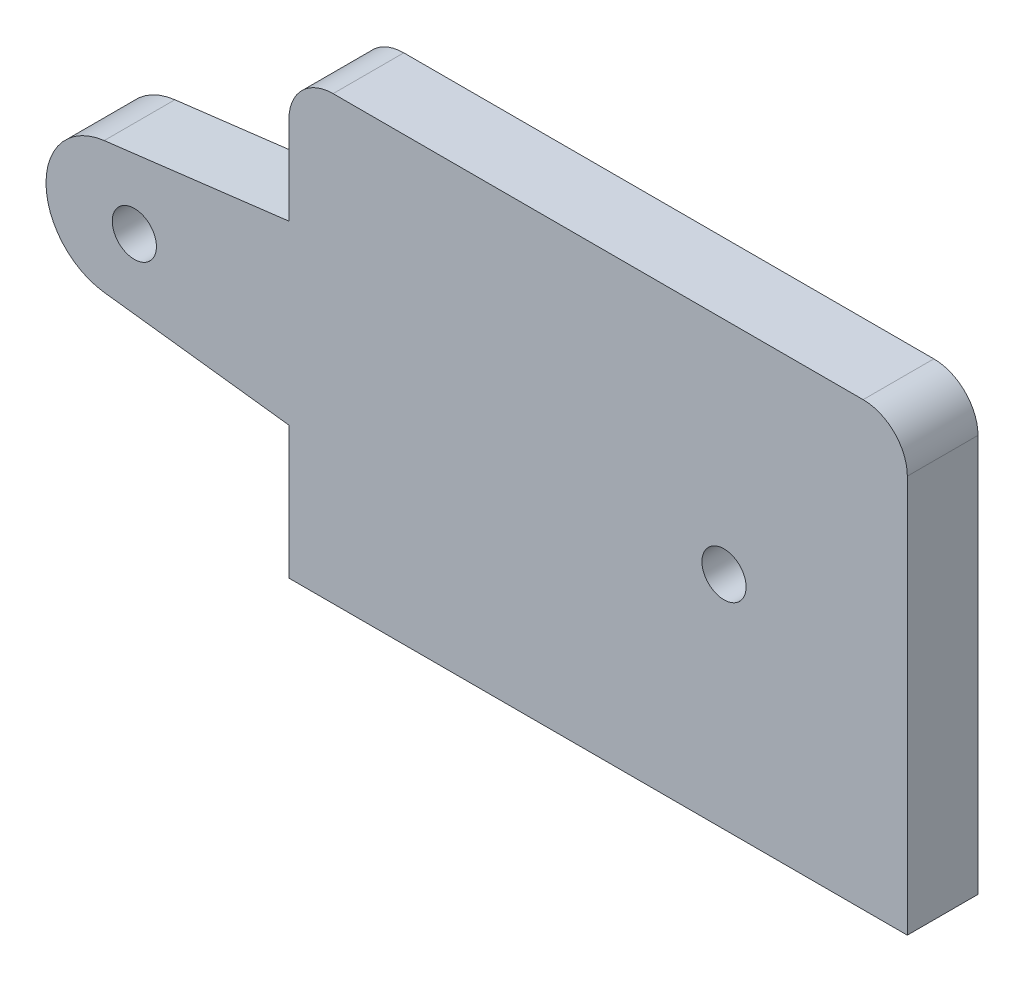
ISO-10303-21;
HEADER;
FILE_DESCRIPTION(('STEP AP214'),'2;1');
FILE_NAME('part.step','',(''),(''),'','','');
FILE_SCHEMA(('AUTOMOTIVE_DESIGN { 1 0 10303 214 1 1 1 1 }'));
ENDSEC;
DATA;
#1=APPLICATION_CONTEXT('core data for automotive mechanical design processes');
#2=APPLICATION_PROTOCOL_DEFINITION('international standard','automotive_design',2000,#1);
#3=PRODUCT_CONTEXT('',#1,'mechanical');
#4=PRODUCT('Part','Part','',(#3));
#5=PRODUCT_RELATED_PRODUCT_CATEGORY('part','',(#4));
#6=PRODUCT_DEFINITION_FORMATION('','',#4);
#7=PRODUCT_DEFINITION_CONTEXT('part definition',#1,'design');
#8=PRODUCT_DEFINITION('design','',#6,#7);
#9=PRODUCT_DEFINITION_SHAPE('','',#8);
#10=(LENGTH_UNIT() NAMED_UNIT(*) SI_UNIT(.MILLI.,.METRE.));
#11=(NAMED_UNIT(*) PLANE_ANGLE_UNIT() SI_UNIT($,.RADIAN.));
#12=(NAMED_UNIT(*) SI_UNIT($,.STERADIAN.) SOLID_ANGLE_UNIT());
#13=UNCERTAINTY_MEASURE_WITH_UNIT(LENGTH_MEASURE(1.E-05),#10,'distance_accuracy_value','');
#14=(GEOMETRIC_REPRESENTATION_CONTEXT(3) GLOBAL_UNCERTAINTY_ASSIGNED_CONTEXT((#13)) GLOBAL_UNIT_ASSIGNED_CONTEXT((#10,
#11,#12)) REPRESENTATION_CONTEXT('',''));
#15=CARTESIAN_POINT('',(0.,0.,0.));
#16=DIRECTION('',(0.,0.,1.));
#17=DIRECTION('',(1.,0.,0.));
#18=AXIS2_PLACEMENT_3D('',#15,#16,#17);
#19=CARTESIAN_POINT('',(30.,20.,8.));
#20=DIRECTION('',(0.,0.,-1.));
#21=DIRECTION('',(-1.,0.,0.));
#22=AXIS2_PLACEMENT_3D('',#19,#20,#21);
#23=CYLINDRICAL_SURFACE('',#22,5.);
#24=CARTESIAN_POINT('',(30.,20.,0.));
#25=DIRECTION('',(0.,0.,1.));
#26=DIRECTION('',(1.,0.,0.));
#27=AXIS2_PLACEMENT_3D('',#24,#25,#26);
#28=CIRCLE('',#27,5.);
#29=CARTESIAN_POINT('',(30.,25.,0.));
#30=VERTEX_POINT('',#29);
#31=CARTESIAN_POINT('',(35.,20.,0.));
#32=VERTEX_POINT('',#31);
#33=EDGE_CURVE('E178',#30,#32,#28,.F.);
#34=ORIENTED_EDGE('',*,*,#33,.F.);
#35=DIRECTION('',(0.,0.,-1.));
#36=VECTOR('',#35,1.);
#37=CARTESIAN_POINT('',(30.,25.,8.));
#38=LINE('',#37,#36);
#39=CARTESIAN_POINT('',(30.,25.,8.));
#40=VERTEX_POINT('',#39);
#41=EDGE_CURVE('E11',#40,#30,#38,.T.);
#42=ORIENTED_EDGE('',*,*,#41,.F.);
#43=CARTESIAN_POINT('',(30.,20.,8.));
#44=DIRECTION('',(0.,0.,1.));
#45=DIRECTION('',(1.,0.,0.));
#46=AXIS2_PLACEMENT_3D('',#43,#44,#45);
#47=CIRCLE('',#46,5.);
#48=CARTESIAN_POINT('',(35.,20.,8.));
#49=VERTEX_POINT('',#48);
#50=EDGE_CURVE('E255',#40,#49,#47,.F.);
#51=ORIENTED_EDGE('',*,*,#50,.T.);
#52=DIRECTION('',(0.,0.,-1.));
#53=VECTOR('',#52,1.);
#54=CARTESIAN_POINT('',(35.,20.,8.));
#55=LINE('',#54,#53);
#56=EDGE_CURVE('E55',#49,#32,#55,.T.);
#57=ORIENTED_EDGE('',*,*,#56,.T.);
#58=EDGE_LOOP('',(#34,#42,#51,#57));
#59=FACE_BOUND('',#58,.T.);
#60=ADVANCED_FACE('F38',(#59),#23,.T.);
#61=CARTESIAN_POINT('',(0.,25.,8.));
#62=DIRECTION('',(0.,1.,0.));
#63=DIRECTION('',(0.,0.,1.));
#64=AXIS2_PLACEMENT_3D('',#61,#62,#63);
#65=PLANE('',#64);
#66=DIRECTION('',(1.,0.,0.));
#67=VECTOR('',#66,1.);
#68=CARTESIAN_POINT('',(0.,25.,0.));
#69=LINE('',#68,#67);
#70=CARTESIAN_POINT('',(-30.,25.,0.));
#71=VERTEX_POINT('',#70);
#72=EDGE_CURVE('E173',#71,#30,#69,.T.);
#73=ORIENTED_EDGE('',*,*,#72,.F.);
#74=DIRECTION('',(0.,0.,-1.));
#75=VECTOR('',#74,1.);
#76=CARTESIAN_POINT('',(-30.,25.,8.));
#77=LINE('',#76,#75);
#78=CARTESIAN_POINT('',(-30.,25.,8.));
#79=VERTEX_POINT('',#78);
#80=EDGE_CURVE('E47',#79,#71,#77,.T.);
#81=ORIENTED_EDGE('',*,*,#80,.F.);
#82=DIRECTION('',(1.,0.,0.));
#83=VECTOR('',#82,1.);
#84=CARTESIAN_POINT('',(0.,25.,8.));
#85=LINE('',#84,#83);
#86=EDGE_CURVE('E257',#79,#40,#85,.T.);
#87=ORIENTED_EDGE('',*,*,#86,.T.);
#88=ORIENTED_EDGE('',*,*,#41,.T.);
#89=EDGE_LOOP('',(#73,#81,#87,#88));
#90=FACE_BOUND('',#89,.T.);
#91=ADVANCED_FACE('F177',(#90),#65,.T.);
#92=CARTESIAN_POINT('',(-30.,20.,8.));
#93=DIRECTION('',(0.,0.,-1.));
#94=DIRECTION('',(-1.,0.,0.));
#95=AXIS2_PLACEMENT_3D('',#92,#93,#94);
#96=CYLINDRICAL_SURFACE('',#95,5.);
#97=CARTESIAN_POINT('',(-30.,20.,0.));
#98=DIRECTION('',(0.,0.,1.));
#99=DIRECTION('',(1.,0.,0.));
#100=AXIS2_PLACEMENT_3D('',#97,#98,#99);
#101=CIRCLE('',#100,5.);
#102=CARTESIAN_POINT('',(-35.,20.,0.));
#103=VERTEX_POINT('',#102);
#104=EDGE_CURVE('E162',#71,#103,#101,.T.);
#105=ORIENTED_EDGE('',*,*,#104,.T.);
#106=DIRECTION('',(0.,0.,-1.));
#107=VECTOR('',#106,1.);
#108=CARTESIAN_POINT('',(-35.,20.,8.));
#109=LINE('',#108,#107);
#110=CARTESIAN_POINT('',(-35.,20.,8.));
#111=VERTEX_POINT('',#110);
#112=EDGE_CURVE('E154',#111,#103,#109,.T.);
#113=ORIENTED_EDGE('',*,*,#112,.F.);
#114=CARTESIAN_POINT('',(-30.,20.,8.));
#115=DIRECTION('',(0.,0.,1.));
#116=DIRECTION('',(1.,0.,0.));
#117=AXIS2_PLACEMENT_3D('',#114,#115,#116);
#118=CIRCLE('',#117,5.);
#119=EDGE_CURVE('E164',#79,#111,#118,.T.);
#120=ORIENTED_EDGE('',*,*,#119,.F.);
#121=ORIENTED_EDGE('',*,*,#80,.T.);
#122=EDGE_LOOP('',(#105,#113,#120,#121));
#123=FACE_BOUND('',#122,.T.);
#124=ADVANCED_FACE('F160',(#123),#96,.T.);
#125=CARTESIAN_POINT('',(-35.,0.,8.));
#126=DIRECTION('',(1.,0.,0.));
#127=DIRECTION('',(0.,1.,0.));
#128=AXIS2_PLACEMENT_3D('',#125,#126,#127);
#129=PLANE('',#128);
#130=DIRECTION('',(0.,-1.,0.));
#131=VECTOR('',#130,1.);
#132=CARTESIAN_POINT('',(-35.,0.,0.));
#133=LINE('',#132,#131);
#134=CARTESIAN_POINT('',(-35.,10.,0.));
#135=VERTEX_POINT('',#134);
#136=EDGE_CURVE('E175',#103,#135,#133,.T.);
#137=ORIENTED_EDGE('',*,*,#136,.T.);
#138=DIRECTION('',(0.,0.,-1.));
#139=VECTOR('',#138,1.);
#140=CARTESIAN_POINT('',(-35.,10.,8.));
#141=LINE('',#140,#139);
#142=CARTESIAN_POINT('',(-35.,10.,8.));
#143=VERTEX_POINT('',#142);
#144=EDGE_CURVE('E151',#143,#135,#141,.T.);
#145=ORIENTED_EDGE('',*,*,#144,.F.);
#146=DIRECTION('',(0.,-1.,0.));
#147=VECTOR('',#146,1.);
#148=CARTESIAN_POINT('',(-35.,0.,8.));
#149=LINE('',#148,#147);
#150=EDGE_CURVE('E136',#111,#143,#149,.T.);
#151=ORIENTED_EDGE('',*,*,#150,.F.);
#152=ORIENTED_EDGE('',*,*,#112,.T.);
#153=EDGE_LOOP('',(#137,#145,#151,#152));
#154=FACE_BOUND('',#153,.T.);
#155=ADVANCED_FACE('F231',(#154),#129,.F.);
#156=CARTESIAN_POINT('',(-1.71915903920015,14.0672519855766,8.));
#157=DIRECTION('',(0.121307488658819,-0.992614977317636,0.));
#158=DIRECTION('',(0.992614977317636,0.121307488658819,0.));
#159=AXIS2_PLACEMENT_3D('',#156,#157,#158);
#160=PLANE('',#159);
#161=DIRECTION('',(-0.992614977317636,-0.121307488658819,0.));
#162=VECTOR('',#161,1.);
#163=CARTESIAN_POINT('',(-1.71915903920015,14.0672519855766,0.));
#164=LINE('',#163,#162);
#165=CARTESIAN_POINT('',(-55.9098061649412,7.44461232988227,0.));
#166=VERTEX_POINT('',#165);
#167=EDGE_CURVE('E185',#135,#166,#164,.T.);
#168=ORIENTED_EDGE('',*,*,#167,.T.);
#169=DIRECTION('',(0.,0.,-1.));
#170=VECTOR('',#169,1.);
#171=CARTESIAN_POINT('',(-55.9098061649412,7.44461232988227,8.));
#172=LINE('',#171,#170);
#173=CARTESIAN_POINT('',(-55.9098061649412,7.44461232988227,8.));
#174=VERTEX_POINT('',#173);
#175=EDGE_CURVE('E148',#174,#166,#172,.T.);
#176=ORIENTED_EDGE('',*,*,#175,.F.);
#177=DIRECTION('',(-0.992614977317636,-0.121307488658819,0.));
#178=VECTOR('',#177,1.);
#179=CARTESIAN_POINT('',(-1.71915903920015,14.0672519855766,8.));
#180=LINE('',#179,#178);
#181=EDGE_CURVE('E263',#143,#174,#180,.T.);
#182=ORIENTED_EDGE('',*,*,#181,.F.);
#183=ORIENTED_EDGE('',*,*,#144,.T.);
#184=EDGE_LOOP('',(#168,#176,#182,#183));
#185=FACE_BOUND('',#184,.T.);
#186=ADVANCED_FACE('F232',(#185),#160,.F.);
#187=CARTESIAN_POINT('',(-55.,0.,8.));
#188=DIRECTION('',(0.,0.,-1.));
#189=DIRECTION('',(-1.,0.,0.));
#190=AXIS2_PLACEMENT_3D('',#187,#188,#189);
#191=CYLINDRICAL_SURFACE('',#190,7.50000000000001);
#192=CARTESIAN_POINT('',(-55.,0.,0.));
#193=DIRECTION('',(0.,0.,1.));
#194=DIRECTION('',(1.,0.,0.));
#195=AXIS2_PLACEMENT_3D('',#192,#193,#194);
#196=CIRCLE('',#195,7.50000000000001);
#197=CARTESIAN_POINT('',(-55.9098061649412,-7.44461232988228,0.));
#198=VERTEX_POINT('',#197);
#199=EDGE_CURVE('E188',#166,#198,#196,.T.);
#200=ORIENTED_EDGE('',*,*,#199,.T.);
#201=DIRECTION('',(0.,0.,-1.));
#202=VECTOR('',#201,1.);
#203=CARTESIAN_POINT('',(-55.9098061649412,-7.44461232988228,8.));
#204=LINE('',#203,#202);
#205=CARTESIAN_POINT('',(-55.9098061649412,-7.44461232988228,8.));
#206=VERTEX_POINT('',#205);
#207=EDGE_CURVE('E142',#206,#198,#204,.T.);
#208=ORIENTED_EDGE('',*,*,#207,.F.);
#209=CARTESIAN_POINT('',(-55.,0.,8.));
#210=DIRECTION('',(0.,0.,1.));
#211=DIRECTION('',(1.,0.,0.));
#212=AXIS2_PLACEMENT_3D('',#209,#210,#211);
#213=CIRCLE('',#212,7.50000000000001);
#214=EDGE_CURVE('E266',#174,#206,#213,.T.);
#215=ORIENTED_EDGE('',*,*,#214,.F.);
#216=ORIENTED_EDGE('',*,*,#175,.T.);
#217=EDGE_LOOP('',(#200,#208,#215,#216));
#218=FACE_BOUND('',#217,.T.);
#219=ADVANCED_FACE('F235',(#218),#191,.T.);
#220=CARTESIAN_POINT('',(-1.71915903920014,-14.0672519855765,8.));
#221=DIRECTION('',(-0.121307488658818,-0.992614977317636,0.));
#222=DIRECTION('',(0.992614977317636,-0.121307488658818,0.));
#223=AXIS2_PLACEMENT_3D('',#220,#221,#222);
#224=PLANE('',#223);
#225=DIRECTION('',(-0.992614977317636,0.121307488658818,0.));
#226=VECTOR('',#225,1.);
#227=CARTESIAN_POINT('',(-1.71915903920014,-14.0672519855765,0.));
#228=LINE('',#227,#226);
#229=CARTESIAN_POINT('',(-35.,-9.99999999999999,0.));
#230=VERTEX_POINT('',#229);
#231=EDGE_CURVE('E191',#230,#198,#228,.T.);
#232=ORIENTED_EDGE('',*,*,#231,.F.);
#233=DIRECTION('',(0.,0.,-1.));
#234=VECTOR('',#233,1.);
#235=CARTESIAN_POINT('',(-35.,-9.99999999999999,8.));
#236=LINE('',#235,#234);
#237=CARTESIAN_POINT('',(-35.,-9.99999999999999,8.));
#238=VERTEX_POINT('',#237);
#239=EDGE_CURVE('E140',#238,#230,#236,.T.);
#240=ORIENTED_EDGE('',*,*,#239,.F.);
#241=DIRECTION('',(-0.992614977317636,0.121307488658818,0.));
#242=VECTOR('',#241,1.);
#243=CARTESIAN_POINT('',(-1.71915903920014,-14.0672519855765,8.));
#244=LINE('',#243,#242);
#245=EDGE_CURVE('E133',#238,#206,#244,.T.);
#246=ORIENTED_EDGE('',*,*,#245,.T.);
#247=ORIENTED_EDGE('',*,*,#207,.T.);
#248=EDGE_LOOP('',(#232,#240,#246,#247));
#249=FACE_BOUND('',#248,.T.);
#250=ADVANCED_FACE('F239',(#249),#224,.T.);
#251=CARTESIAN_POINT('',(-35.,-25.,0.));
#252=VERTEX_POINT('',#251);
#253=EDGE_CURVE('E139',#230,#252,#133,.T.);
#254=ORIENTED_EDGE('',*,*,#253,.T.);
#255=DIRECTION('',(0.,0.,-1.));
#256=VECTOR('',#255,1.);
#257=CARTESIAN_POINT('',(-35.,-25.,8.));
#258=LINE('',#257,#256);
#259=CARTESIAN_POINT('',(-35.,-25.,8.));
#260=VERTEX_POINT('',#259);
#261=EDGE_CURVE('E121',#260,#252,#258,.T.);
#262=ORIENTED_EDGE('',*,*,#261,.F.);
#263=EDGE_CURVE('E126',#238,#260,#149,.T.);
#264=ORIENTED_EDGE('',*,*,#263,.F.);
#265=ORIENTED_EDGE('',*,*,#239,.T.);
#266=EDGE_LOOP('',(#254,#262,#264,#265));
#267=FACE_BOUND('',#266,.T.);
#268=ADVANCED_FACE('F137',(#267),#129,.F.);
#269=CARTESIAN_POINT('',(0.,-25.,8.));
#270=DIRECTION('',(0.,1.,0.));
#271=DIRECTION('',(0.,0.,1.));
#272=AXIS2_PLACEMENT_3D('',#269,#270,#271);
#273=PLANE('',#272);
#274=DIRECTION('',(1.,0.,0.));
#275=VECTOR('',#274,1.);
#276=CARTESIAN_POINT('',(0.,-25.,0.));
#277=LINE('',#276,#275);
#278=CARTESIAN_POINT('',(35.,-25.,0.));
#279=VERTEX_POINT('',#278);
#280=EDGE_CURVE('E194',#252,#279,#277,.T.);
#281=ORIENTED_EDGE('',*,*,#280,.T.);
#282=DIRECTION('',(0.,0.,-1.));
#283=VECTOR('',#282,1.);
#284=CARTESIAN_POINT('',(35.,-25.,8.));
#285=LINE('',#284,#283);
#286=CARTESIAN_POINT('',(35.,-25.,8.));
#287=VERTEX_POINT('',#286);
#288=EDGE_CURVE('E87',#287,#279,#285,.T.);
#289=ORIENTED_EDGE('',*,*,#288,.F.);
#290=DIRECTION('',(1.,0.,0.));
#291=VECTOR('',#290,1.);
#292=CARTESIAN_POINT('',(0.,-25.,8.));
#293=LINE('',#292,#291);
#294=EDGE_CURVE('E117',#260,#287,#293,.T.);
#295=ORIENTED_EDGE('',*,*,#294,.F.);
#296=ORIENTED_EDGE('',*,*,#261,.T.);
#297=EDGE_LOOP('',(#281,#289,#295,#296));
#298=FACE_BOUND('',#297,.T.);
#299=ADVANCED_FACE('F119',(#298),#273,.F.);
#300=CARTESIAN_POINT('',(35.,0.,8.));
#301=DIRECTION('',(1.,0.,0.));
#302=DIRECTION('',(0.,1.,0.));
#303=AXIS2_PLACEMENT_3D('',#300,#301,#302);
#304=PLANE('',#303);
#305=DIRECTION('',(0.,-1.,0.));
#306=VECTOR('',#305,1.);
#307=CARTESIAN_POINT('',(35.,0.,0.));
#308=LINE('',#307,#306);
#309=EDGE_CURVE('E196',#32,#279,#308,.T.);
#310=ORIENTED_EDGE('',*,*,#309,.F.);
#311=ORIENTED_EDGE('',*,*,#56,.F.);
#312=DIRECTION('',(0.,-1.,0.));
#313=VECTOR('',#312,1.);
#314=CARTESIAN_POINT('',(35.,0.,8.));
#315=LINE('',#314,#313);
#316=EDGE_CURVE('E125',#49,#287,#315,.T.);
#317=ORIENTED_EDGE('',*,*,#316,.T.);
#318=ORIENTED_EDGE('',*,*,#288,.T.);
#319=EDGE_LOOP('',(#310,#311,#317,#318));
#320=FACE_BOUND('',#319,.T.);
#321=ADVANCED_FACE('F214',(#320),#304,.T.);
#322=CARTESIAN_POINT('',(14.25,0.,8.));
#323=DIRECTION('',(0.,0.,-1.));
#324=DIRECTION('',(-1.,0.,0.));
#325=AXIS2_PLACEMENT_3D('',#322,#323,#324);
#326=CYLINDRICAL_SURFACE('',#325,2.5);
#327=CARTESIAN_POINT('',(14.25,0.,8.));
#328=DIRECTION('',(0.,0.,1.));
#329=DIRECTION('',(1.,0.,0.));
#330=AXIS2_PLACEMENT_3D('',#327,#328,#329);
#331=CIRCLE('',#330,2.5);
#332=CARTESIAN_POINT('',(16.75,0.,8.));
#333=VERTEX_POINT('',#332);
#334=EDGE_CURVE('E201',#333,#333,#331,.T.);
#335=ORIENTED_EDGE('',*,*,#334,.T.);
#336=EDGE_LOOP('',(#335));
#337=FACE_BOUND('',#336,.T.);
#338=CARTESIAN_POINT('',(14.25,0.,0.));
#339=DIRECTION('',(0.,0.,1.));
#340=DIRECTION('',(1.,0.,0.));
#341=AXIS2_PLACEMENT_3D('',#338,#339,#340);
#342=CIRCLE('',#341,2.5);
#343=CARTESIAN_POINT('',(16.75,0.,0.));
#344=VERTEX_POINT('',#343);
#345=EDGE_CURVE('E180',#344,#344,#342,.T.);
#346=ORIENTED_EDGE('',*,*,#345,.F.);
#347=EDGE_LOOP('',(#346));
#348=FACE_BOUND('',#347,.T.);
#349=ADVANCED_FACE('F40',(#337,#348),#326,.F.);
#350=CARTESIAN_POINT('',(-52.5,0.,8.));
#351=DIRECTION('',(0.,0.,-1.));
#352=DIRECTION('',(-1.,0.,0.));
#353=AXIS2_PLACEMENT_3D('',#350,#351,#352);
#354=CYLINDRICAL_SURFACE('',#353,2.49999999999999);
#355=CARTESIAN_POINT('',(-52.5,0.,8.));
#356=DIRECTION('',(0.,0.,1.));
#357=DIRECTION('',(1.,0.,0.));
#358=AXIS2_PLACEMENT_3D('',#355,#356,#357);
#359=CIRCLE('',#358,2.49999999999999);
#360=CARTESIAN_POINT('',(-50.,0.,8.));
#361=VERTEX_POINT('',#360);
#362=EDGE_CURVE('E202',#361,#361,#359,.T.);
#363=ORIENTED_EDGE('',*,*,#362,.T.);
#364=EDGE_LOOP('',(#363));
#365=FACE_BOUND('',#364,.T.);
#366=CARTESIAN_POINT('',(-52.5,0.,0.));
#367=DIRECTION('',(0.,0.,1.));
#368=DIRECTION('',(1.,0.,0.));
#369=AXIS2_PLACEMENT_3D('',#366,#367,#368);
#370=CIRCLE('',#369,2.49999999999999);
#371=CARTESIAN_POINT('',(-50.,0.,0.));
#372=VERTEX_POINT('',#371);
#373=EDGE_CURVE('E199',#372,#372,#370,.T.);
#374=ORIENTED_EDGE('',*,*,#373,.F.);
#375=EDGE_LOOP('',(#374));
#376=FACE_BOUND('',#375,.T.);
#377=ADVANCED_FACE('F213',(#365,#376),#354,.F.);
#378=CARTESIAN_POINT('',(0.,0.,8.));
#379=DIRECTION('',(0.,0.,1.));
#380=DIRECTION('',(1.,0.,0.));
#381=AXIS2_PLACEMENT_3D('',#378,#379,#380);
#382=PLANE('',#381);
#383=ORIENTED_EDGE('',*,*,#334,.F.);
#384=EDGE_LOOP('',(#383));
#385=FACE_BOUND('',#384,.T.);
#386=ORIENTED_EDGE('',*,*,#50,.F.);
#387=ORIENTED_EDGE('',*,*,#86,.F.);
#388=ORIENTED_EDGE('',*,*,#119,.T.);
#389=ORIENTED_EDGE('',*,*,#150,.T.);
#390=ORIENTED_EDGE('',*,*,#181,.T.);
#391=ORIENTED_EDGE('',*,*,#214,.T.);
#392=ORIENTED_EDGE('',*,*,#245,.F.);
#393=ORIENTED_EDGE('',*,*,#263,.T.);
#394=ORIENTED_EDGE('',*,*,#294,.T.);
#395=ORIENTED_EDGE('',*,*,#316,.F.);
#396=EDGE_LOOP('',(#386,#387,#388,#389,#390,#391,#392,#393,#394,#395));
#397=FACE_BOUND('',#396,.T.);
#398=ORIENTED_EDGE('',*,*,#362,.F.);
#399=EDGE_LOOP('',(#398));
#400=FACE_BOUND('',#399,.T.);
#401=ADVANCED_FACE('F130',(#385,#397,#400),#382,.T.);
#402=CARTESIAN_POINT('',(0.,0.,0.));
#403=DIRECTION('',(0.,0.,1.));
#404=DIRECTION('',(1.,0.,0.));
#405=AXIS2_PLACEMENT_3D('',#402,#403,#404);
#406=PLANE('',#405);
#407=ORIENTED_EDGE('',*,*,#345,.T.);
#408=EDGE_LOOP('',(#407));
#409=FACE_BOUND('',#408,.T.);
#410=ORIENTED_EDGE('',*,*,#33,.T.);
#411=ORIENTED_EDGE('',*,*,#309,.T.);
#412=ORIENTED_EDGE('',*,*,#280,.F.);
#413=ORIENTED_EDGE('',*,*,#253,.F.);
#414=ORIENTED_EDGE('',*,*,#231,.T.);
#415=ORIENTED_EDGE('',*,*,#199,.F.);
#416=ORIENTED_EDGE('',*,*,#167,.F.);
#417=ORIENTED_EDGE('',*,*,#136,.F.);
#418=ORIENTED_EDGE('',*,*,#104,.F.);
#419=ORIENTED_EDGE('',*,*,#72,.T.);
#420=EDGE_LOOP('',(#410,#411,#412,#413,#414,#415,#416,#417,#418,#419));
#421=FACE_BOUND('',#420,.T.);
#422=ORIENTED_EDGE('',*,*,#373,.T.);
#423=EDGE_LOOP('',(#422));
#424=FACE_BOUND('',#423,.T.);
#425=ADVANCED_FACE('F171',(#409,#421,#424),#406,.F.);
#426=CLOSED_SHELL('',(#60,#91,#124,#155,#186,#219,#250,#268,#299,#321,#349,#377,#401,#425));
#427=MANIFOLD_SOLID_BREP('B2',#426);
#428=ADVANCED_BREP_SHAPE_REPRESENTATION('',(#18,#427),#14);
#429=SHAPE_DEFINITION_REPRESENTATION(#9,#428);
ENDSEC;
END-ISO-10303-21;
